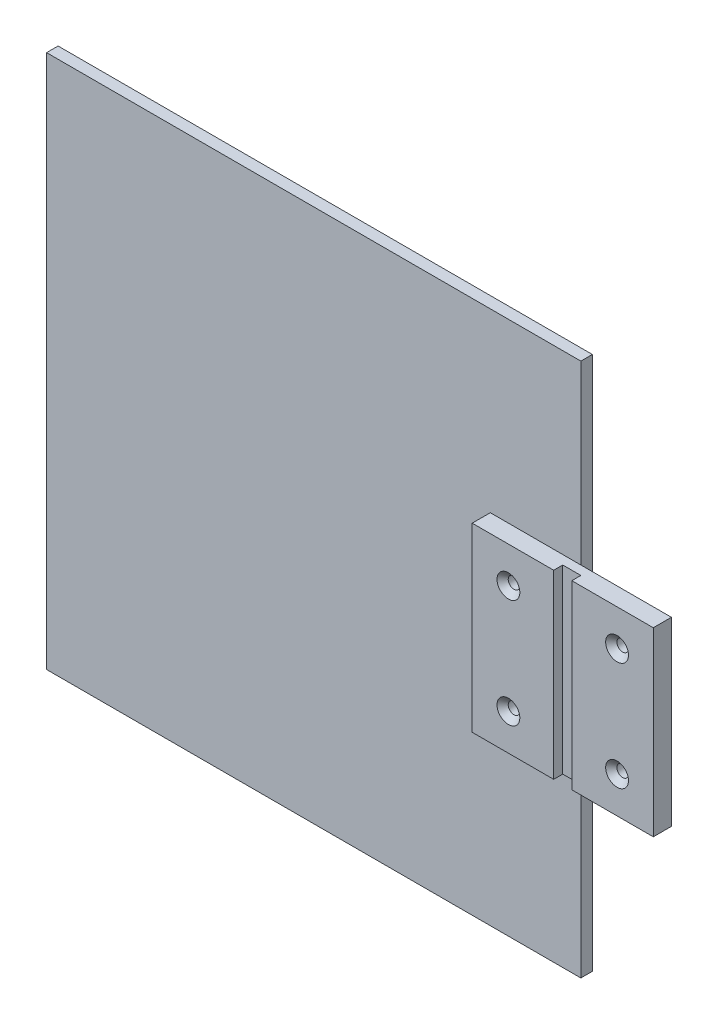
ISO-10303-21;
HEADER;
FILE_DESCRIPTION(('STEP AP214'),'2;1');
FILE_NAME('part.step','',(''),(''),'','','');
FILE_SCHEMA(('AUTOMOTIVE_DESIGN { 1 0 10303 214 1 1 1 1 }'));
ENDSEC;
DATA;
#1=APPLICATION_CONTEXT('core data for automotive mechanical design processes');
#2=APPLICATION_PROTOCOL_DEFINITION('international standard','automotive_design',2000,#1);
#3=PRODUCT_CONTEXT('',#1,'mechanical');
#4=PRODUCT('Part','Part','',(#3));
#5=PRODUCT_RELATED_PRODUCT_CATEGORY('part','',(#4));
#6=PRODUCT_DEFINITION_FORMATION('','',#4);
#7=PRODUCT_DEFINITION_CONTEXT('part definition',#1,'design');
#8=PRODUCT_DEFINITION('design','',#6,#7);
#9=PRODUCT_DEFINITION_SHAPE('','',#8);
#10=(LENGTH_UNIT() NAMED_UNIT(*) SI_UNIT(.MILLI.,.METRE.));
#11=(NAMED_UNIT(*) PLANE_ANGLE_UNIT() SI_UNIT($,.RADIAN.));
#12=(NAMED_UNIT(*) SI_UNIT($,.STERADIAN.) SOLID_ANGLE_UNIT());
#13=UNCERTAINTY_MEASURE_WITH_UNIT(LENGTH_MEASURE(1.E-05),#10,'distance_accuracy_value','');
#14=(GEOMETRIC_REPRESENTATION_CONTEXT(3) GLOBAL_UNCERTAINTY_ASSIGNED_CONTEXT((#13)) GLOBAL_UNIT_ASSIGNED_CONTEXT((#10,
#11,#12)) REPRESENTATION_CONTEXT('',''));
#15=CARTESIAN_POINT('',(0.,0.,0.));
#16=DIRECTION('',(0.,0.,1.));
#17=DIRECTION('',(1.,0.,0.));
#18=AXIS2_PLACEMENT_3D('',#15,#16,#17);
#19=CARTESIAN_POINT('',(0.,0.,16.35));
#20=DIRECTION('',(0.,0.,1.));
#21=DIRECTION('',(1.,0.,0.));
#22=AXIS2_PLACEMENT_3D('',#19,#20,#21);
#23=PLANE('',#22);
#24=DIRECTION('',(0.,1.,0.));
#25=VECTOR('',#24,1.);
#26=CARTESIAN_POINT('',(300.,197.5,16.35));
#27=LINE('',#26,#25);
#28=CARTESIAN_POINT('',(300.,97.5,16.35));
#29=VERTEX_POINT('',#28);
#30=CARTESIAN_POINT('',(300.,197.5,16.35));
#31=VERTEX_POINT('',#30);
#32=EDGE_CURVE('E155',#29,#31,#27,.T.);
#33=ORIENTED_EDGE('',*,*,#32,.F.);
#34=DIRECTION('',(1.,0.,0.));
#35=VECTOR('',#34,1.);
#36=CARTESIAN_POINT('',(245.,97.5,16.35));
#37=LINE('',#36,#35);
#38=CARTESIAN_POINT('',(345.,97.5,16.35));
#39=VERTEX_POINT('',#38);
#40=EDGE_CURVE('E255',#29,#39,#37,.T.);
#41=ORIENTED_EDGE('',*,*,#40,.T.);
#42=DIRECTION('',(0.,1.,0.));
#43=VECTOR('',#42,1.);
#44=CARTESIAN_POINT('',(345.,197.5,16.35));
#45=LINE('',#44,#43);
#46=CARTESIAN_POINT('',(345.,197.5,16.35));
#47=VERTEX_POINT('',#46);
#48=EDGE_CURVE('E244',#39,#47,#45,.T.);
#49=ORIENTED_EDGE('',*,*,#48,.T.);
#50=DIRECTION('',(-1.,0.,0.));
#51=VECTOR('',#50,1.);
#52=CARTESIAN_POINT('',(245.,197.5,16.35));
#53=LINE('',#52,#51);
#54=EDGE_CURVE('E249',#47,#31,#53,.T.);
#55=ORIENTED_EDGE('',*,*,#54,.T.);
#56=EDGE_LOOP('',(#33,#41,#49,#55));
#57=FACE_BOUND('',#56,.T.);
#58=CARTESIAN_POINT('',(325.,177.5,16.35));
#59=DIRECTION('',(0.,0.,1.));
#60=DIRECTION('',(1.,0.,0.));
#61=AXIS2_PLACEMENT_3D('',#58,#59,#60);
#62=CIRCLE('',#61,6.29999999999997);
#63=CARTESIAN_POINT('',(331.3,177.5,16.35));
#64=VERTEX_POINT('',#63);
#65=EDGE_CURVE('E231',#64,#64,#62,.T.);
#66=ORIENTED_EDGE('',*,*,#65,.F.);
#67=EDGE_LOOP('',(#66));
#68=FACE_BOUND('',#67,.T.);
#69=CARTESIAN_POINT('',(325.,117.5,16.35));
#70=DIRECTION('',(0.,0.,1.));
#71=DIRECTION('',(1.,0.,0.));
#72=AXIS2_PLACEMENT_3D('',#69,#70,#71);
#73=CIRCLE('',#72,6.29999999999997);
#74=CARTESIAN_POINT('',(331.3,117.5,16.35));
#75=VERTEX_POINT('',#74);
#76=EDGE_CURVE('E207',#75,#75,#73,.T.);
#77=ORIENTED_EDGE('',*,*,#76,.F.);
#78=EDGE_LOOP('',(#77));
#79=FACE_BOUND('',#78,.T.);
#80=ADVANCED_FACE('F45',(#57,#68,#79),#23,.T.);
#81=CARTESIAN_POINT('',(0.,0.,6.35));
#82=DIRECTION('',(0.,0.,-1.));
#83=DIRECTION('',(-1.,0.,0.));
#84=AXIS2_PLACEMENT_3D('',#81,#82,#83);
#85=PLANE('',#84);
#86=DIRECTION('',(1.,0.,0.));
#87=VECTOR('',#86,1.);
#88=CARTESIAN_POINT('',(245.,97.5,6.35));
#89=LINE('',#88,#87);
#90=CARTESIAN_POINT('',(245.,97.5,6.35));
#91=VERTEX_POINT('',#90);
#92=CARTESIAN_POINT('',(295.,97.5,6.35));
#93=VERTEX_POINT('',#92);
#94=EDGE_CURVE('E71',#91,#93,#89,.T.);
#95=ORIENTED_EDGE('',*,*,#94,.F.);
#96=DIRECTION('',(0.,-1.,0.));
#97=VECTOR('',#96,1.);
#98=CARTESIAN_POINT('',(245.,197.5,6.35));
#99=LINE('',#98,#97);
#100=CARTESIAN_POINT('',(245.,197.5,6.35));
#101=VERTEX_POINT('',#100);
#102=EDGE_CURVE('E266',#101,#91,#99,.T.);
#103=ORIENTED_EDGE('',*,*,#102,.F.);
#104=DIRECTION('',(-1.,0.,0.));
#105=VECTOR('',#104,1.);
#106=CARTESIAN_POINT('',(245.,197.5,6.35));
#107=LINE('',#106,#105);
#108=CARTESIAN_POINT('',(295.,197.5,6.35));
#109=VERTEX_POINT('',#108);
#110=EDGE_CURVE('E11',#109,#101,#107,.T.);
#111=ORIENTED_EDGE('',*,*,#110,.F.);
#112=DIRECTION('',(0.,1.,0.));
#113=VECTOR('',#112,1.);
#114=CARTESIAN_POINT('',(295.,0.,6.35));
#115=LINE('',#114,#113);
#116=CARTESIAN_POINT('',(295.,295.,6.35));
#117=VERTEX_POINT('',#116);
#118=EDGE_CURVE('E296',#109,#117,#115,.T.);
#119=ORIENTED_EDGE('',*,*,#118,.T.);
#120=DIRECTION('',(-1.,0.,0.));
#121=VECTOR('',#120,1.);
#122=CARTESIAN_POINT('',(0.,295.,6.35));
#123=LINE('',#122,#121);
#124=CARTESIAN_POINT('',(0.,295.,6.35));
#125=VERTEX_POINT('',#124);
#126=EDGE_CURVE('E300',#117,#125,#123,.T.);
#127=ORIENTED_EDGE('',*,*,#126,.T.);
#128=DIRECTION('',(0.,-1.,0.));
#129=VECTOR('',#128,1.);
#130=CARTESIAN_POINT('',(0.,0.,6.35));
#131=LINE('',#130,#129);
#132=CARTESIAN_POINT('',(0.,0.,6.35));
#133=VERTEX_POINT('',#132);
#134=EDGE_CURVE('E288',#125,#133,#131,.T.);
#135=ORIENTED_EDGE('',*,*,#134,.T.);
#136=DIRECTION('',(1.,0.,0.));
#137=VECTOR('',#136,1.);
#138=CARTESIAN_POINT('',(0.,0.,6.35));
#139=LINE('',#138,#137);
#140=CARTESIAN_POINT('',(295.,0.,6.35));
#141=VERTEX_POINT('',#140);
#142=EDGE_CURVE('E292',#133,#141,#139,.T.);
#143=ORIENTED_EDGE('',*,*,#142,.T.);
#144=EDGE_CURVE('E297',#141,#93,#115,.T.);
#145=ORIENTED_EDGE('',*,*,#144,.T.);
#146=EDGE_LOOP('',(#95,#103,#111,#119,#127,#135,#143,#145));
#147=FACE_BOUND('',#146,.T.);
#148=ADVANCED_FACE('F347',(#147),#85,.F.);
#149=CARTESIAN_POINT('',(0.,0.,6.35));
#150=DIRECTION('',(1.,0.,0.));
#151=DIRECTION('',(0.,0.,-1.));
#152=AXIS2_PLACEMENT_3D('',#149,#150,#151);
#153=PLANE('',#152);
#154=DIRECTION('',(0.,-1.,0.));
#155=VECTOR('',#154,1.);
#156=CARTESIAN_POINT('',(0.,0.,0.));
#157=LINE('',#156,#155);
#158=CARTESIAN_POINT('',(0.,295.,0.));
#159=VERTEX_POINT('',#158);
#160=CARTESIAN_POINT('',(0.,0.,0.));
#161=VERTEX_POINT('',#160);
#162=EDGE_CURVE('E287',#159,#161,#157,.T.);
#163=ORIENTED_EDGE('',*,*,#162,.T.);
#164=DIRECTION('',(0.,0.,-1.));
#165=VECTOR('',#164,1.);
#166=CARTESIAN_POINT('',(0.,0.,6.35));
#167=LINE('',#166,#165);
#168=EDGE_CURVE('E49',#133,#161,#167,.T.);
#169=ORIENTED_EDGE('',*,*,#168,.F.);
#170=ORIENTED_EDGE('',*,*,#134,.F.);
#171=DIRECTION('',(0.,0.,-1.));
#172=VECTOR('',#171,1.);
#173=CARTESIAN_POINT('',(0.,295.,6.35));
#174=LINE('',#173,#172);
#175=EDGE_CURVE('E304',#125,#159,#174,.T.);
#176=ORIENTED_EDGE('',*,*,#175,.T.);
#177=EDGE_LOOP('',(#163,#169,#170,#176));
#178=FACE_BOUND('',#177,.T.);
#179=ADVANCED_FACE('F47',(#178),#153,.F.);
#180=CARTESIAN_POINT('',(0.,0.,6.35));
#181=DIRECTION('',(0.,1.,0.));
#182=DIRECTION('',(0.,0.,1.));
#183=AXIS2_PLACEMENT_3D('',#180,#181,#182);
#184=PLANE('',#183);
#185=DIRECTION('',(1.,0.,0.));
#186=VECTOR('',#185,1.);
#187=CARTESIAN_POINT('',(0.,0.,0.));
#188=LINE('',#187,#186);
#189=CARTESIAN_POINT('',(295.,0.,0.));
#190=VERTEX_POINT('',#189);
#191=EDGE_CURVE('E308',#161,#190,#188,.T.);
#192=ORIENTED_EDGE('',*,*,#191,.T.);
#193=DIRECTION('',(0.,0.,-1.));
#194=VECTOR('',#193,1.);
#195=CARTESIAN_POINT('',(295.,0.,6.35));
#196=LINE('',#195,#194);
#197=EDGE_CURVE('E322',#141,#190,#196,.T.);
#198=ORIENTED_EDGE('',*,*,#197,.F.);
#199=ORIENTED_EDGE('',*,*,#142,.F.);
#200=ORIENTED_EDGE('',*,*,#168,.T.);
#201=EDGE_LOOP('',(#192,#198,#199,#200));
#202=FACE_BOUND('',#201,.T.);
#203=ADVANCED_FACE('F333',(#202),#184,.F.);
#204=CARTESIAN_POINT('',(295.,0.,6.35));
#205=DIRECTION('',(-1.,0.,0.));
#206=DIRECTION('',(0.,0.,1.));
#207=AXIS2_PLACEMENT_3D('',#204,#205,#206);
#208=PLANE('',#207);
#209=DIRECTION('',(0.,1.,0.));
#210=VECTOR('',#209,1.);
#211=CARTESIAN_POINT('',(295.,0.,0.));
#212=LINE('',#211,#210);
#213=CARTESIAN_POINT('',(295.,295.,0.));
#214=VERTEX_POINT('',#213);
#215=EDGE_CURVE('E311',#190,#214,#212,.T.);
#216=ORIENTED_EDGE('',*,*,#215,.T.);
#217=DIRECTION('',(0.,0.,-1.));
#218=VECTOR('',#217,1.);
#219=CARTESIAN_POINT('',(295.,295.,6.35));
#220=LINE('',#219,#218);
#221=EDGE_CURVE('E319',#117,#214,#220,.T.);
#222=ORIENTED_EDGE('',*,*,#221,.F.);
#223=ORIENTED_EDGE('',*,*,#118,.F.);
#224=EDGE_CURVE('E301',#93,#109,#115,.T.);
#225=ORIENTED_EDGE('',*,*,#224,.F.);
#226=ORIENTED_EDGE('',*,*,#144,.F.);
#227=ORIENTED_EDGE('',*,*,#197,.T.);
#228=EDGE_LOOP('',(#216,#222,#223,#225,#226,#227));
#229=FACE_BOUND('',#228,.T.);
#230=ADVANCED_FACE('F342',(#229),#208,.F.);
#231=CARTESIAN_POINT('',(0.,295.,6.35));
#232=DIRECTION('',(0.,-1.,0.));
#233=DIRECTION('',(0.,0.,-1.));
#234=AXIS2_PLACEMENT_3D('',#231,#232,#233);
#235=PLANE('',#234);
#236=DIRECTION('',(-1.,0.,0.));
#237=VECTOR('',#236,1.);
#238=CARTESIAN_POINT('',(0.,295.,0.));
#239=LINE('',#238,#237);
#240=EDGE_CURVE('E293',#214,#159,#239,.T.);
#241=ORIENTED_EDGE('',*,*,#240,.T.);
#242=ORIENTED_EDGE('',*,*,#175,.F.);
#243=ORIENTED_EDGE('',*,*,#126,.F.);
#244=ORIENTED_EDGE('',*,*,#221,.T.);
#245=EDGE_LOOP('',(#241,#242,#243,#244));
#246=FACE_BOUND('',#245,.T.);
#247=ADVANCED_FACE('F346',(#246),#235,.F.);
#248=CARTESIAN_POINT('',(0.,0.,0.));
#249=DIRECTION('',(0.,0.,-1.));
#250=DIRECTION('',(-1.,0.,0.));
#251=AXIS2_PLACEMENT_3D('',#248,#249,#250);
#252=PLANE('',#251);
#253=ORIENTED_EDGE('',*,*,#162,.F.);
#254=ORIENTED_EDGE('',*,*,#240,.F.);
#255=ORIENTED_EDGE('',*,*,#215,.F.);
#256=ORIENTED_EDGE('',*,*,#191,.F.);
#257=EDGE_LOOP('',(#253,#254,#255,#256));
#258=FACE_BOUND('',#257,.T.);
#259=ADVANCED_FACE('F340',(#258),#252,.T.);
#260=CARTESIAN_POINT('',(0.,0.,6.35));
#261=DIRECTION('',(0.,0.,1.));
#262=DIRECTION('',(1.,0.,0.));
#263=AXIS2_PLACEMENT_3D('',#260,#261,#262);
#264=PLANE('',#263);
#265=CARTESIAN_POINT('',(325.,117.5,6.35));
#266=DIRECTION('',(0.,0.,1.));
#267=DIRECTION('',(1.,0.,0.));
#268=AXIS2_PLACEMENT_3D('',#265,#266,#267);
#269=CIRCLE('',#268,3.19999999999998);
#270=CARTESIAN_POINT('',(328.2,117.5,6.35));
#271=VERTEX_POINT('',#270);
#272=EDGE_CURVE('E215',#271,#271,#269,.T.);
#273=ORIENTED_EDGE('',*,*,#272,.T.);
#274=EDGE_LOOP('',(#273));
#275=FACE_BOUND('',#274,.T.);
#276=CARTESIAN_POINT('',(325.,177.5,6.35));
#277=DIRECTION('',(0.,0.,1.));
#278=DIRECTION('',(1.,0.,0.));
#279=AXIS2_PLACEMENT_3D('',#276,#277,#278);
#280=CIRCLE('',#279,3.19999999999998);
#281=CARTESIAN_POINT('',(328.2,177.5,6.35));
#282=VERTEX_POINT('',#281);
#283=EDGE_CURVE('E239',#282,#282,#280,.T.);
#284=ORIENTED_EDGE('',*,*,#283,.T.);
#285=EDGE_LOOP('',(#284));
#286=FACE_BOUND('',#285,.T.);
#287=CARTESIAN_POINT('',(345.,97.5,6.35));
#288=VERTEX_POINT('',#287);
#289=EDGE_CURVE('E269',#93,#288,#89,.T.);
#290=ORIENTED_EDGE('',*,*,#289,.F.);
#291=ORIENTED_EDGE('',*,*,#224,.T.);
#292=CARTESIAN_POINT('',(345.,197.5,6.35));
#293=VERTEX_POINT('',#292);
#294=EDGE_CURVE('E56',#293,#109,#107,.T.);
#295=ORIENTED_EDGE('',*,*,#294,.F.);
#296=DIRECTION('',(0.,1.,0.));
#297=VECTOR('',#296,1.);
#298=CARTESIAN_POINT('',(345.,197.5,6.35));
#299=LINE('',#298,#297);
#300=EDGE_CURVE('E243',#288,#293,#299,.T.);
#301=ORIENTED_EDGE('',*,*,#300,.F.);
#302=EDGE_LOOP('',(#290,#291,#295,#301));
#303=FACE_BOUND('',#302,.T.);
#304=ADVANCED_FACE('F353',(#275,#286,#303),#264,.F.);
#305=CARTESIAN_POINT('',(345.,197.5,16.35));
#306=DIRECTION('',(-1.,0.,0.));
#307=DIRECTION('',(0.,-1.,0.));
#308=AXIS2_PLACEMENT_3D('',#305,#306,#307);
#309=PLANE('',#308);
#310=ORIENTED_EDGE('',*,*,#300,.T.);
#311=DIRECTION('',(0.,0.,-1.));
#312=VECTOR('',#311,1.);
#313=CARTESIAN_POINT('',(345.,197.5,16.35));
#314=LINE('',#313,#312);
#315=EDGE_CURVE('E283',#47,#293,#314,.T.);
#316=ORIENTED_EDGE('',*,*,#315,.F.);
#317=ORIENTED_EDGE('',*,*,#48,.F.);
#318=DIRECTION('',(0.,0.,-1.));
#319=VECTOR('',#318,1.);
#320=CARTESIAN_POINT('',(345.,97.5,16.35));
#321=LINE('',#320,#319);
#322=EDGE_CURVE('E260',#39,#288,#321,.T.);
#323=ORIENTED_EDGE('',*,*,#322,.T.);
#324=EDGE_LOOP('',(#310,#316,#317,#323));
#325=FACE_BOUND('',#324,.T.);
#326=ADVANCED_FACE('F359',(#325),#309,.F.);
#327=CARTESIAN_POINT('',(245.,197.5,16.35));
#328=DIRECTION('',(0.,-1.,0.));
#329=DIRECTION('',(0.,0.,-1.));
#330=AXIS2_PLACEMENT_3D('',#327,#328,#329);
#331=PLANE('',#330);
#332=DIRECTION('',(-1.,0.,0.));
#333=VECTOR('',#332,1.);
#334=CARTESIAN_POINT('',(300.,197.5,11.35));
#335=LINE('',#334,#333);
#336=CARTESIAN_POINT('',(300.,197.5,11.35));
#337=VERTEX_POINT('',#336);
#338=CARTESIAN_POINT('',(290.,197.5,11.35));
#339=VERTEX_POINT('',#338);
#340=EDGE_CURVE('E166',#337,#339,#335,.T.);
#341=ORIENTED_EDGE('',*,*,#340,.F.);
#342=DIRECTION('',(0.,0.,1.));
#343=VECTOR('',#342,1.);
#344=CARTESIAN_POINT('',(300.,197.5,11.35));
#345=LINE('',#344,#343);
#346=EDGE_CURVE('E149',#337,#31,#345,.T.);
#347=ORIENTED_EDGE('',*,*,#346,.T.);
#348=ORIENTED_EDGE('',*,*,#54,.F.);
#349=ORIENTED_EDGE('',*,*,#315,.T.);
#350=ORIENTED_EDGE('',*,*,#294,.T.);
#351=ORIENTED_EDGE('',*,*,#110,.T.);
#352=DIRECTION('',(0.,0.,-1.));
#353=VECTOR('',#352,1.);
#354=CARTESIAN_POINT('',(245.,197.5,16.35));
#355=LINE('',#354,#353);
#356=CARTESIAN_POINT('',(245.,197.5,16.35));
#357=VERTEX_POINT('',#356);
#358=EDGE_CURVE('E279',#357,#101,#355,.T.);
#359=ORIENTED_EDGE('',*,*,#358,.F.);
#360=CARTESIAN_POINT('',(290.,197.5,16.35));
#361=VERTEX_POINT('',#360);
#362=EDGE_CURVE('E248',#361,#357,#53,.T.);
#363=ORIENTED_EDGE('',*,*,#362,.F.);
#364=DIRECTION('',(0.,0.,1.));
#365=VECTOR('',#364,1.);
#366=CARTESIAN_POINT('',(290.,197.5,11.35));
#367=LINE('',#366,#365);
#368=EDGE_CURVE('E63',#339,#361,#367,.T.);
#369=ORIENTED_EDGE('',*,*,#368,.F.);
#370=EDGE_LOOP('',(#341,#347,#348,#349,#350,#351,#359,#363,#369));
#371=FACE_BOUND('',#370,.T.);
#372=ADVANCED_FACE('F172',(#371),#331,.F.);
#373=CARTESIAN_POINT('',(245.,197.5,16.35));
#374=DIRECTION('',(1.,0.,0.));
#375=DIRECTION('',(0.,1.,0.));
#376=AXIS2_PLACEMENT_3D('',#373,#374,#375);
#377=PLANE('',#376);
#378=ORIENTED_EDGE('',*,*,#102,.T.);
#379=DIRECTION('',(0.,0.,-1.));
#380=VECTOR('',#379,1.);
#381=CARTESIAN_POINT('',(245.,97.5,16.35));
#382=LINE('',#381,#380);
#383=CARTESIAN_POINT('',(245.,97.5,16.35));
#384=VERTEX_POINT('',#383);
#385=EDGE_CURVE('E275',#384,#91,#382,.T.);
#386=ORIENTED_EDGE('',*,*,#385,.F.);
#387=DIRECTION('',(0.,-1.,0.));
#388=VECTOR('',#387,1.);
#389=CARTESIAN_POINT('',(245.,197.5,16.35));
#390=LINE('',#389,#388);
#391=EDGE_CURVE('E252',#357,#384,#390,.T.);
#392=ORIENTED_EDGE('',*,*,#391,.F.);
#393=ORIENTED_EDGE('',*,*,#358,.T.);
#394=EDGE_LOOP('',(#378,#386,#392,#393));
#395=FACE_BOUND('',#394,.T.);
#396=ADVANCED_FACE('F421',(#395),#377,.F.);
#397=CARTESIAN_POINT('',(245.,97.5,16.35));
#398=DIRECTION('',(0.,1.,0.));
#399=DIRECTION('',(0.,0.,1.));
#400=AXIS2_PLACEMENT_3D('',#397,#398,#399);
#401=PLANE('',#400);
#402=ORIENTED_EDGE('',*,*,#40,.F.);
#403=DIRECTION('',(0.,0.,1.));
#404=VECTOR('',#403,1.);
#405=CARTESIAN_POINT('',(300.,97.5,11.35));
#406=LINE('',#405,#404);
#407=CARTESIAN_POINT('',(300.,97.5,11.35));
#408=VERTEX_POINT('',#407);
#409=EDGE_CURVE('E186',#408,#29,#406,.T.);
#410=ORIENTED_EDGE('',*,*,#409,.F.);
#411=DIRECTION('',(1.,0.,0.));
#412=VECTOR('',#411,1.);
#413=CARTESIAN_POINT('',(300.,97.5,11.35));
#414=LINE('',#413,#412);
#415=CARTESIAN_POINT('',(290.,97.5,11.35));
#416=VERTEX_POINT('',#415);
#417=EDGE_CURVE('E160',#416,#408,#414,.T.);
#418=ORIENTED_EDGE('',*,*,#417,.F.);
#419=DIRECTION('',(0.,0.,1.));
#420=VECTOR('',#419,1.);
#421=CARTESIAN_POINT('',(290.,97.5,11.35));
#422=LINE('',#421,#420);
#423=CARTESIAN_POINT('',(290.,97.5,16.35));
#424=VERTEX_POINT('',#423);
#425=EDGE_CURVE('E190',#416,#424,#422,.T.);
#426=ORIENTED_EDGE('',*,*,#425,.T.);
#427=EDGE_CURVE('E256',#384,#424,#37,.T.);
#428=ORIENTED_EDGE('',*,*,#427,.F.);
#429=ORIENTED_EDGE('',*,*,#385,.T.);
#430=ORIENTED_EDGE('',*,*,#94,.T.);
#431=ORIENTED_EDGE('',*,*,#289,.T.);
#432=ORIENTED_EDGE('',*,*,#322,.F.);
#433=EDGE_LOOP('',(#402,#410,#418,#426,#428,#429,#430,#431,#432));
#434=FACE_BOUND('',#433,.T.);
#435=ADVANCED_FACE('F363',(#434),#401,.F.);
#436=DIRECTION('',(0.,-1.,0.));
#437=VECTOR('',#436,1.);
#438=CARTESIAN_POINT('',(290.,197.5,16.35));
#439=LINE('',#438,#437);
#440=EDGE_CURVE('E170',#361,#424,#439,.T.);
#441=ORIENTED_EDGE('',*,*,#440,.F.);
#442=ORIENTED_EDGE('',*,*,#362,.T.);
#443=ORIENTED_EDGE('',*,*,#391,.T.);
#444=ORIENTED_EDGE('',*,*,#427,.T.);
#445=EDGE_LOOP('',(#441,#442,#443,#444));
#446=FACE_BOUND('',#445,.T.);
#447=CARTESIAN_POINT('',(265.,177.5,16.35));
#448=DIRECTION('',(0.,0.,1.));
#449=DIRECTION('',(1.,0.,0.));
#450=AXIS2_PLACEMENT_3D('',#447,#448,#449);
#451=CIRCLE('',#450,6.29999999999997);
#452=CARTESIAN_POINT('',(271.3,177.5,16.35));
#453=VERTEX_POINT('',#452);
#454=EDGE_CURVE('E189',#453,#453,#451,.T.);
#455=ORIENTED_EDGE('',*,*,#454,.F.);
#456=EDGE_LOOP('',(#455));
#457=FACE_BOUND('',#456,.T.);
#458=CARTESIAN_POINT('',(265.,117.5,16.35));
#459=DIRECTION('',(0.,0.,1.));
#460=DIRECTION('',(1.,0.,0.));
#461=AXIS2_PLACEMENT_3D('',#458,#459,#460);
#462=CIRCLE('',#461,6.29999999999997);
#463=CARTESIAN_POINT('',(271.3,117.5,16.35));
#464=VERTEX_POINT('',#463);
#465=EDGE_CURVE('E219',#464,#464,#462,.T.);
#466=ORIENTED_EDGE('',*,*,#465,.F.);
#467=EDGE_LOOP('',(#466));
#468=FACE_BOUND('',#467,.T.);
#469=ADVANCED_FACE('F371',(#446,#457,#468),#23,.T.);
#470=CARTESIAN_POINT('',(325.,177.5,16.35));
#471=DIRECTION('',(0.,0.,1.));
#472=DIRECTION('',(1.,0.,0.));
#473=AXIS2_PLACEMENT_3D('',#470,#471,#472);
#474=CYLINDRICAL_SURFACE('',#473,3.19999999999998);
#475=ORIENTED_EDGE('',*,*,#283,.F.);
#476=EDGE_LOOP('',(#475));
#477=FACE_BOUND('',#476,.T.);
#478=CARTESIAN_POINT('',(325.,177.5,13.25));
#479=DIRECTION('',(0.,0.,1.));
#480=DIRECTION('',(1.,0.,0.));
#481=AXIS2_PLACEMENT_3D('',#478,#479,#480);
#482=CIRCLE('',#481,3.19999999999998);
#483=CARTESIAN_POINT('',(328.2,177.5,13.25));
#484=VERTEX_POINT('',#483);
#485=EDGE_CURVE('E235',#484,#484,#482,.T.);
#486=ORIENTED_EDGE('',*,*,#485,.T.);
#487=EDGE_LOOP('',(#486));
#488=FACE_BOUND('',#487,.T.);
#489=ADVANCED_FACE('F409',(#477,#488),#474,.F.);
#490=CARTESIAN_POINT('',(325.,177.5,16.35));
#491=DIRECTION('',(0.,0.,1.));
#492=DIRECTION('',(1.,0.,0.));
#493=AXIS2_PLACEMENT_3D('',#490,#491,#492);
#494=CONICAL_SURFACE('',#493,6.29999999999997,0.785398163397447);
#495=ORIENTED_EDGE('',*,*,#485,.F.);
#496=EDGE_LOOP('',(#495));
#497=FACE_BOUND('',#496,.T.);
#498=ORIENTED_EDGE('',*,*,#65,.T.);
#499=EDGE_LOOP('',(#498));
#500=FACE_BOUND('',#499,.T.);
#501=ADVANCED_FACE('F405',(#497,#500),#494,.F.);
#502=CARTESIAN_POINT('',(265.,117.5,6.35));
#503=DIRECTION('',(0.,0.,1.));
#504=DIRECTION('',(1.,0.,0.));
#505=AXIS2_PLACEMENT_3D('',#502,#503,#504);
#506=CONICAL_SURFACE('',#505,3.19999999999998,1.02974425867665);
#507=CARTESIAN_POINT('',(265.,117.5,4.42724601911181));
#508=VERTEX_POINT('',#507);
#509=VERTEX_LOOP('',#508);
#510=FACE_BOUND('',#509,.T.);
#511=CARTESIAN_POINT('',(265.,117.5,6.35));
#512=DIRECTION('',(0.,0.,1.));
#513=DIRECTION('',(1.,0.,0.));
#514=AXIS2_PLACEMENT_3D('',#511,#512,#513);
#515=CIRCLE('',#514,3.19999999999998);
#516=CARTESIAN_POINT('',(268.2,117.5,6.35));
#517=VERTEX_POINT('',#516);
#518=EDGE_CURVE('E227',#517,#517,#515,.T.);
#519=ORIENTED_EDGE('',*,*,#518,.T.);
#520=EDGE_LOOP('',(#519));
#521=FACE_BOUND('',#520,.T.);
#522=ADVANCED_FACE('F401',(#510,#521),#506,.F.);
#523=CARTESIAN_POINT('',(265.,117.5,16.35));
#524=DIRECTION('',(0.,0.,1.));
#525=DIRECTION('',(1.,0.,0.));
#526=AXIS2_PLACEMENT_3D('',#523,#524,#525);
#527=CYLINDRICAL_SURFACE('',#526,3.19999999999998);
#528=ORIENTED_EDGE('',*,*,#518,.F.);
#529=EDGE_LOOP('',(#528));
#530=FACE_BOUND('',#529,.T.);
#531=CARTESIAN_POINT('',(265.,117.5,13.25));
#532=DIRECTION('',(0.,0.,1.));
#533=DIRECTION('',(1.,0.,0.));
#534=AXIS2_PLACEMENT_3D('',#531,#532,#533);
#535=CIRCLE('',#534,3.19999999999998);
#536=CARTESIAN_POINT('',(268.2,117.5,13.25));
#537=VERTEX_POINT('',#536);
#538=EDGE_CURVE('E223',#537,#537,#535,.T.);
#539=ORIENTED_EDGE('',*,*,#538,.T.);
#540=EDGE_LOOP('',(#539));
#541=FACE_BOUND('',#540,.T.);
#542=ADVANCED_FACE('F397',(#530,#541),#527,.F.);
#543=CARTESIAN_POINT('',(265.,117.5,16.35));
#544=DIRECTION('',(0.,0.,1.));
#545=DIRECTION('',(1.,0.,0.));
#546=AXIS2_PLACEMENT_3D('',#543,#544,#545);
#547=CONICAL_SURFACE('',#546,6.29999999999997,0.785398163397447);
#548=ORIENTED_EDGE('',*,*,#538,.F.);
#549=EDGE_LOOP('',(#548));
#550=FACE_BOUND('',#549,.T.);
#551=ORIENTED_EDGE('',*,*,#465,.T.);
#552=EDGE_LOOP('',(#551));
#553=FACE_BOUND('',#552,.T.);
#554=ADVANCED_FACE('F389',(#550,#553),#547,.F.);
#555=CARTESIAN_POINT('',(325.,117.5,16.35));
#556=DIRECTION('',(0.,0.,1.));
#557=DIRECTION('',(1.,0.,0.));
#558=AXIS2_PLACEMENT_3D('',#555,#556,#557);
#559=CYLINDRICAL_SURFACE('',#558,3.19999999999998);
#560=ORIENTED_EDGE('',*,*,#272,.F.);
#561=EDGE_LOOP('',(#560));
#562=FACE_BOUND('',#561,.T.);
#563=CARTESIAN_POINT('',(325.,117.5,13.25));
#564=DIRECTION('',(0.,0.,1.));
#565=DIRECTION('',(1.,0.,0.));
#566=AXIS2_PLACEMENT_3D('',#563,#564,#565);
#567=CIRCLE('',#566,3.19999999999998);
#568=CARTESIAN_POINT('',(328.2,117.5,13.25));
#569=VERTEX_POINT('',#568);
#570=EDGE_CURVE('E211',#569,#569,#567,.T.);
#571=ORIENTED_EDGE('',*,*,#570,.T.);
#572=EDGE_LOOP('',(#571));
#573=FACE_BOUND('',#572,.T.);
#574=ADVANCED_FACE('F379',(#562,#573),#559,.F.);
#575=CARTESIAN_POINT('',(325.,117.5,16.35));
#576=DIRECTION('',(0.,0.,1.));
#577=DIRECTION('',(1.,0.,0.));
#578=AXIS2_PLACEMENT_3D('',#575,#576,#577);
#579=CONICAL_SURFACE('',#578,6.29999999999997,0.785398163397447);
#580=ORIENTED_EDGE('',*,*,#570,.F.);
#581=EDGE_LOOP('',(#580));
#582=FACE_BOUND('',#581,.T.);
#583=ORIENTED_EDGE('',*,*,#76,.T.);
#584=EDGE_LOOP('',(#583));
#585=FACE_BOUND('',#584,.T.);
#586=ADVANCED_FACE('F376',(#582,#585),#579,.F.);
#587=CARTESIAN_POINT('',(265.,177.5,6.35));
#588=DIRECTION('',(0.,0.,1.));
#589=DIRECTION('',(1.,0.,0.));
#590=AXIS2_PLACEMENT_3D('',#587,#588,#589);
#591=CONICAL_SURFACE('',#590,3.19999999999998,1.02974425867665);
#592=CARTESIAN_POINT('',(265.,177.5,4.42724601911181));
#593=VERTEX_POINT('',#592);
#594=VERTEX_LOOP('',#593);
#595=FACE_BOUND('',#594,.T.);
#596=CARTESIAN_POINT('',(265.,177.5,6.35));
#597=DIRECTION('',(0.,0.,1.));
#598=DIRECTION('',(1.,0.,0.));
#599=AXIS2_PLACEMENT_3D('',#596,#597,#598);
#600=CIRCLE('',#599,3.19999999999998);
#601=CARTESIAN_POINT('',(268.2,177.5,6.35));
#602=VERTEX_POINT('',#601);
#603=EDGE_CURVE('E203',#602,#602,#600,.T.);
#604=ORIENTED_EDGE('',*,*,#603,.T.);
#605=EDGE_LOOP('',(#604));
#606=FACE_BOUND('',#605,.T.);
#607=ADVANCED_FACE('F378',(#595,#606),#591,.F.);
#608=CARTESIAN_POINT('',(265.,177.5,16.35));
#609=DIRECTION('',(0.,0.,1.));
#610=DIRECTION('',(1.,0.,0.));
#611=AXIS2_PLACEMENT_3D('',#608,#609,#610);
#612=CYLINDRICAL_SURFACE('',#611,3.19999999999998);
#613=ORIENTED_EDGE('',*,*,#603,.F.);
#614=EDGE_LOOP('',(#613));
#615=FACE_BOUND('',#614,.T.);
#616=CARTESIAN_POINT('',(265.,177.5,13.25));
#617=DIRECTION('',(0.,0.,1.));
#618=DIRECTION('',(1.,0.,0.));
#619=AXIS2_PLACEMENT_3D('',#616,#617,#618);
#620=CIRCLE('',#619,3.19999999999998);
#621=CARTESIAN_POINT('',(268.2,177.5,13.25));
#622=VERTEX_POINT('',#621);
#623=EDGE_CURVE('E199',#622,#622,#620,.T.);
#624=ORIENTED_EDGE('',*,*,#623,.T.);
#625=EDGE_LOOP('',(#624));
#626=FACE_BOUND('',#625,.T.);
#627=ADVANCED_FACE('F386',(#615,#626),#612,.F.);
#628=CARTESIAN_POINT('',(265.,177.5,16.35));
#629=DIRECTION('',(0.,0.,1.));
#630=DIRECTION('',(1.,0.,0.));
#631=AXIS2_PLACEMENT_3D('',#628,#629,#630);
#632=CONICAL_SURFACE('',#631,6.29999999999997,0.785398163397447);
#633=ORIENTED_EDGE('',*,*,#623,.F.);
#634=EDGE_LOOP('',(#633));
#635=FACE_BOUND('',#634,.T.);
#636=ORIENTED_EDGE('',*,*,#454,.T.);
#637=EDGE_LOOP('',(#636));
#638=FACE_BOUND('',#637,.T.);
#639=ADVANCED_FACE('F562',(#635,#638),#632,.F.);
#640=CARTESIAN_POINT('',(300.,197.5,11.35));
#641=DIRECTION('',(1.,0.,0.));
#642=DIRECTION('',(0.,0.,-1.));
#643=AXIS2_PLACEMENT_3D('',#640,#641,#642);
#644=PLANE('',#643);
#645=ORIENTED_EDGE('',*,*,#32,.T.);
#646=ORIENTED_EDGE('',*,*,#346,.F.);
#647=DIRECTION('',(0.,1.,0.));
#648=VECTOR('',#647,1.);
#649=CARTESIAN_POINT('',(300.,197.5,11.35));
#650=LINE('',#649,#648);
#651=EDGE_CURVE('E152',#408,#337,#650,.T.);
#652=ORIENTED_EDGE('',*,*,#651,.F.);
#653=ORIENTED_EDGE('',*,*,#409,.T.);
#654=EDGE_LOOP('',(#645,#646,#652,#653));
#655=FACE_BOUND('',#654,.T.);
#656=ADVANCED_FACE('F151',(#655),#644,.F.);
#657=CARTESIAN_POINT('',(290.,197.5,11.35));
#658=DIRECTION('',(-1.,0.,0.));
#659=DIRECTION('',(0.,0.,1.));
#660=AXIS2_PLACEMENT_3D('',#657,#658,#659);
#661=PLANE('',#660);
#662=ORIENTED_EDGE('',*,*,#440,.T.);
#663=ORIENTED_EDGE('',*,*,#425,.F.);
#664=DIRECTION('',(0.,-1.,0.));
#665=VECTOR('',#664,1.);
#666=CARTESIAN_POINT('',(290.,197.5,11.35));
#667=LINE('',#666,#665);
#668=EDGE_CURVE('E175',#339,#416,#667,.T.);
#669=ORIENTED_EDGE('',*,*,#668,.F.);
#670=ORIENTED_EDGE('',*,*,#368,.T.);
#671=EDGE_LOOP('',(#662,#663,#669,#670));
#672=FACE_BOUND('',#671,.T.);
#673=ADVANCED_FACE('F584',(#672),#661,.F.);
#674=CARTESIAN_POINT('',(0.,0.,11.35));
#675=DIRECTION('',(0.,0.,-1.));
#676=DIRECTION('',(-1.,0.,0.));
#677=AXIS2_PLACEMENT_3D('',#674,#675,#676);
#678=PLANE('',#677);
#679=ORIENTED_EDGE('',*,*,#651,.T.);
#680=ORIENTED_EDGE('',*,*,#340,.T.);
#681=ORIENTED_EDGE('',*,*,#668,.T.);
#682=ORIENTED_EDGE('',*,*,#417,.T.);
#683=EDGE_LOOP('',(#679,#680,#681,#682));
#684=FACE_BOUND('',#683,.T.);
#685=ADVANCED_FACE('F164',(#684),#678,.F.);
#686=CLOSED_SHELL('',(#80,#148,#179,#203,#230,#247,#259,#304,#326,#372,#396,#435,#469,#489,#501,
#522,#542,#554,#574,#586,#607,#627,#639,#656,#673,#685));
#687=MANIFOLD_SOLID_BREP('B2',#686);
#688=ADVANCED_BREP_SHAPE_REPRESENTATION('',(#18,#687),#14);
#689=SHAPE_DEFINITION_REPRESENTATION(#9,#688);
ENDSEC;
END-ISO-10303-21;
